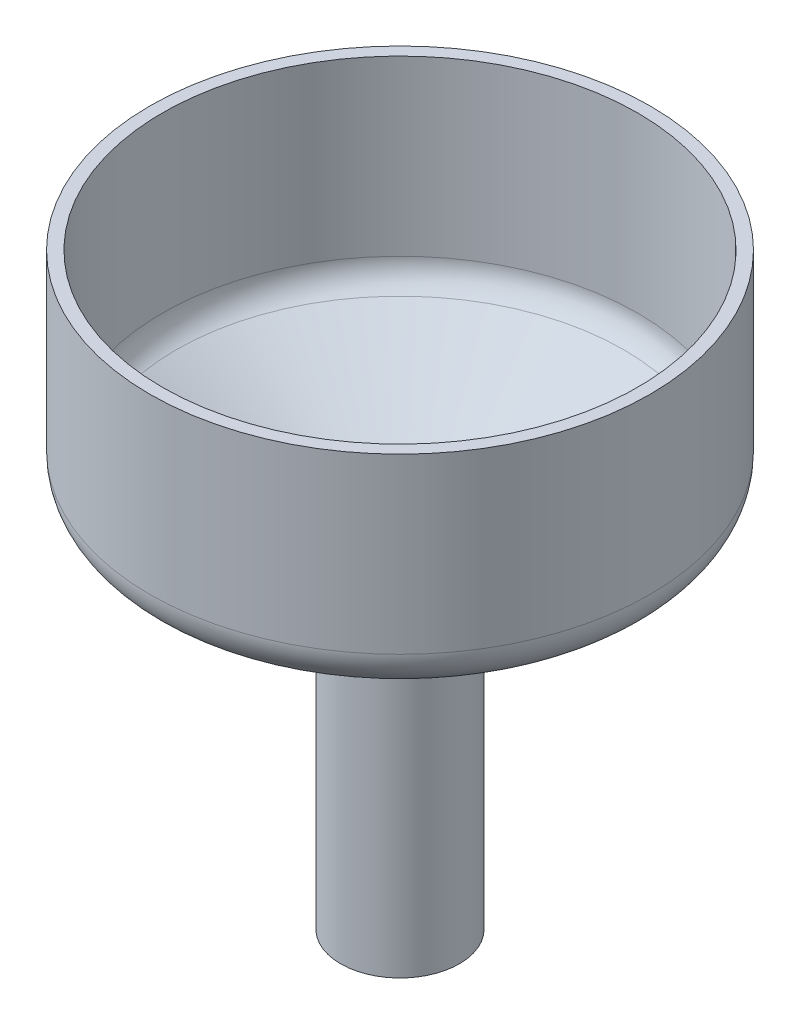
ISO-10303-21;
HEADER;
FILE_DESCRIPTION(('STEP AP214'),'2;1');
FILE_NAME('part.step','',(''),(''),'','','');
FILE_SCHEMA(('AUTOMOTIVE_DESIGN { 1 0 10303 214 1 1 1 1 }'));
ENDSEC;
DATA;
#1=APPLICATION_CONTEXT('core data for automotive mechanical design processes');
#2=APPLICATION_PROTOCOL_DEFINITION('international standard','automotive_design',2000,#1);
#3=PRODUCT_CONTEXT('',#1,'mechanical');
#4=PRODUCT('Part','Part','',(#3));
#5=PRODUCT_RELATED_PRODUCT_CATEGORY('part','',(#4));
#6=PRODUCT_DEFINITION_FORMATION('','',#4);
#7=PRODUCT_DEFINITION_CONTEXT('part definition',#1,'design');
#8=PRODUCT_DEFINITION('design','',#6,#7);
#9=PRODUCT_DEFINITION_SHAPE('','',#8);
#10=(LENGTH_UNIT() NAMED_UNIT(*) SI_UNIT(.MILLI.,.METRE.));
#11=(NAMED_UNIT(*) PLANE_ANGLE_UNIT() SI_UNIT($,.RADIAN.));
#12=(NAMED_UNIT(*) SI_UNIT($,.STERADIAN.) SOLID_ANGLE_UNIT());
#13=UNCERTAINTY_MEASURE_WITH_UNIT(LENGTH_MEASURE(1.E-05),#10,'distance_accuracy_value','');
#14=(GEOMETRIC_REPRESENTATION_CONTEXT(3) GLOBAL_UNCERTAINTY_ASSIGNED_CONTEXT((#13)) GLOBAL_UNIT_ASSIGNED_CONTEXT((#10,
#11,#12)) REPRESENTATION_CONTEXT('',''));
#15=CARTESIAN_POINT('',(0.,0.,0.));
#16=DIRECTION('',(0.,0.,1.));
#17=DIRECTION('',(1.,0.,0.));
#18=AXIS2_PLACEMENT_3D('',#15,#16,#17);
#19=CARTESIAN_POINT('',(0.,34.,0.));
#20=DIRECTION('',(0.,-1.,0.));
#21=DIRECTION('',(0.,0.,-1.));
#22=AXIS2_PLACEMENT_3D('',#19,#20,#21);
#23=CYLINDRICAL_SURFACE('',#22,7.25);
#24=CARTESIAN_POINT('',(0.,34.,0.));
#25=DIRECTION('',(0.,1.,0.));
#26=DIRECTION('',(0.,0.,1.));
#27=AXIS2_PLACEMENT_3D('',#24,#25,#26);
#28=CIRCLE('',#27,7.25);
#29=CARTESIAN_POINT('',(0.,34.,7.24999999999999));
#30=VERTEX_POINT('',#29);
#31=EDGE_CURVE('E50',#30,#30,#28,.T.);
#32=ORIENTED_EDGE('',*,*,#31,.F.);
#33=EDGE_LOOP('',(#32));
#34=FACE_BOUND('',#33,.T.);
#35=CARTESIAN_POINT('',(0.,0.,0.));
#36=DIRECTION('',(0.,1.,0.));
#37=DIRECTION('',(0.,0.,1.));
#38=AXIS2_PLACEMENT_3D('',#35,#36,#37);
#39=CIRCLE('',#38,7.25);
#40=CARTESIAN_POINT('',(0.,0.,7.25));
#41=VERTEX_POINT('',#40);
#42=EDGE_CURVE('E54',#41,#41,#39,.T.);
#43=ORIENTED_EDGE('',*,*,#42,.T.);
#44=EDGE_LOOP('',(#43));
#45=FACE_BOUND('',#44,.T.);
#46=ADVANCED_FACE('F39',(#34,#45),#23,.T.);
#47=CARTESIAN_POINT('',(0.,0.,0.));
#48=DIRECTION('',(0.,1.,0.));
#49=DIRECTION('',(0.,0.,1.));
#50=AXIS2_PLACEMENT_3D('',#47,#48,#49);
#51=PLANE('',#50);
#52=CARTESIAN_POINT('',(0.,0.,0.));
#53=DIRECTION('',(0.,1.,0.));
#54=DIRECTION('',(0.,0.,1.));
#55=AXIS2_PLACEMENT_3D('',#52,#53,#54);
#56=CIRCLE('',#55,5.75);
#57=CARTESIAN_POINT('',(0.,0.,5.75));
#58=VERTEX_POINT('',#57);
#59=EDGE_CURVE('E68',#58,#58,#56,.T.);
#60=ORIENTED_EDGE('',*,*,#59,.T.);
#61=EDGE_LOOP('',(#60));
#62=FACE_BOUND('',#61,.T.);
#63=ORIENTED_EDGE('',*,*,#42,.F.);
#64=EDGE_LOOP('',(#63));
#65=FACE_BOUND('',#64,.T.);
#66=ADVANCED_FACE('F98',(#62,#65),#51,.F.);
#67=CARTESIAN_POINT('',(0.,34.,0.));
#68=DIRECTION('',(0.,1.,0.));
#69=DIRECTION('',(0.,0.,1.));
#70=AXIS2_PLACEMENT_3D('',#67,#68,#69);
#71=CONICAL_SURFACE('',#70,7.25,1.0351341645638);
#72=CARTESIAN_POINT('',(0.,46.3470249026098,0.));
#73=DIRECTION('',(0.,1.,0.));
#74=DIRECTION('',(0.,0.,1.));
#75=AXIS2_PLACEMENT_3D('',#72,#73,#74);
#76=CIRCLE('',#75,28.0520528250491);
#77=CARTESIAN_POINT('',(0.,46.3470249026098,28.0520528250491));
#78=VERTEX_POINT('',#77);
#79=EDGE_CURVE('E11',#78,#78,#76,.F.);
#80=CARTESIAN_POINT('',(0.,46.3470249026098,28.0520528250491));
#81=CARTESIAN_POINT('',(0.,46.2184100598743,27.8353647747882));
#82=CARTESIAN_POINT('',(0.,46.0897952171388,27.6186767245273));
#83=CARTESIAN_POINT('',(0.,45.8325655316677,27.1853006240054));
#84=CARTESIAN_POINT('',(0.,45.7039506889322,26.9686125737445));
#85=CARTESIAN_POINT('',(0.,45.4467210034612,26.5352364732226));
#86=CARTESIAN_POINT('',(0.,45.3181061607256,26.3185484229617));
#87=CARTESIAN_POINT('',(0.,45.0608764752546,25.8851723224398));
#88=CARTESIAN_POINT('',(0.,44.9322616325191,25.6684842721789));
#89=CARTESIAN_POINT('',(0.,44.6750319470481,25.235108171657));
#90=CARTESIAN_POINT('',(0.,44.5464171043125,25.0184201213961));
#91=CARTESIAN_POINT('',(0.,44.2891874188415,24.5850440208743));
#92=CARTESIAN_POINT('',(0.,44.160572576106,24.3683559706133));
#93=CARTESIAN_POINT('',(0.,43.9033428906349,23.9349798700915));
#94=CARTESIAN_POINT('',(0.,43.7747280478994,23.7182918198305));
#95=CARTESIAN_POINT('',(0.,43.5174983624284,23.2849157193087));
#96=CARTESIAN_POINT('',(0.,43.3888835196929,23.0682276690478));
#97=CARTESIAN_POINT('',(0.,43.1316538342218,22.6348515685259));
#98=CARTESIAN_POINT('',(0.,43.0030389914863,22.418163518265));
#99=CARTESIAN_POINT('',(0.,42.7458093060153,21.9847874177431));
#100=CARTESIAN_POINT('',(0.,42.6171944632798,21.7680993674822));
#101=CARTESIAN_POINT('',(0.,42.3599647778087,21.3347232669603));
#102=CARTESIAN_POINT('',(0.,42.2313499350732,21.1180352166994));
#103=CARTESIAN_POINT('',(0.,41.9741202496022,20.6846591161776));
#104=CARTESIAN_POINT('',(0.,41.8455054068666,20.4679710659166));
#105=CARTESIAN_POINT('',(0.,41.5882757213956,20.0345949653948));
#106=CARTESIAN_POINT('',(0.,41.4596608786601,19.8179069151338));
#107=CARTESIAN_POINT('',(0.,41.202431193189,19.384530814612));
#108=CARTESIAN_POINT('',(0.,41.0738163504535,19.1678427643511));
#109=CARTESIAN_POINT('',(0.,40.8165866649825,18.7344666638292));
#110=CARTESIAN_POINT('',(0.,40.687971822247,18.5177786135683));
#111=CARTESIAN_POINT('',(0.,40.4307421367759,18.0844025130464));
#112=CARTESIAN_POINT('',(0.,40.3021272940404,17.8677144627855));
#113=CARTESIAN_POINT('',(0.,40.0448976085694,17.4343383622636));
#114=CARTESIAN_POINT('',(0.,39.9162827658339,17.2176503120027));
#115=CARTESIAN_POINT('',(0.,39.6590530803628,16.7842742114808));
#116=CARTESIAN_POINT('',(0.,39.5304382376273,16.5675861612199));
#117=CARTESIAN_POINT('',(0.,39.2732085521563,16.1342100606981));
#118=CARTESIAN_POINT('',(0.,39.1445937094207,15.9175220104371));
#119=CARTESIAN_POINT('',(0.,38.8873640239497,15.4841459099153));
#120=CARTESIAN_POINT('',(0.,38.7587491812142,15.2674578596543));
#121=CARTESIAN_POINT('',(0.,38.5015194957432,14.8340817591325));
#122=CARTESIAN_POINT('',(0.,38.3729046530076,14.6173937088716));
#123=CARTESIAN_POINT('',(0.,38.1156749675366,14.1840176083497));
#124=CARTESIAN_POINT('',(0.,37.9870601248011,13.9673295580888));
#125=CARTESIAN_POINT('',(0.,37.72983043933,13.5339534575669));
#126=CARTESIAN_POINT('',(0.,37.6012155965945,13.317265407306));
#127=CARTESIAN_POINT('',(0.,37.3439859111235,12.8838893067841));
#128=CARTESIAN_POINT('',(0.,37.215371068388,12.6672012565232));
#129=CARTESIAN_POINT('',(0.,36.9581413829169,12.2338251560013));
#130=CARTESIAN_POINT('',(0.,36.8295265401814,12.0171371057404));
#131=CARTESIAN_POINT('',(0.,36.5722968547104,11.5837610052186));
#132=CARTESIAN_POINT('',(0.,36.4436820119749,11.3670729549576));
#133=CARTESIAN_POINT('',(0.,36.1864523265038,10.9336968544358));
#134=CARTESIAN_POINT('',(0.,36.0578374837683,10.7170088041748));
#135=CARTESIAN_POINT('',(0.,35.8006077982973,10.283632703653));
#136=CARTESIAN_POINT('',(0.,35.6719929555617,10.0669446533921));
#137=CARTESIAN_POINT('',(0.,35.4147632700907,9.63356855287021));
#138=CARTESIAN_POINT('',(0.,35.2861484273552,9.41688050260928));
#139=CARTESIAN_POINT('',(0.,35.0289187418841,8.98350440208742));
#140=CARTESIAN_POINT('',(0.,34.9003038991486,8.76681635182649));
#141=CARTESIAN_POINT('',(0.,34.6430742136776,8.33344025130464));
#142=CARTESIAN_POINT('',(0.,34.5144593709421,8.11675220104371));
#143=CARTESIAN_POINT('',(0.,34.257229685471,7.68337610052185));
#144=CARTESIAN_POINT('',(0.,34.1286148427355,7.46668805026092));
#145=CARTESIAN_POINT('',(0.,34.,7.24999999999999));
#146=B_SPLINE_CURVE_WITH_KNOTS('',3,(#80,#81,#82,#83,#84,#85,#86,#87,#88,#89,#90,#91,#92,#93,
#94,#95,#96,#97,#98,#99,#100,#101,#102,#103,#104,#105,#106,#107,#108,#109,#110,#111,#112,#113,
#114,#115,#116,#117,#118,#119,#120,#121,#122,#123,#124,#125,#126,#127,#128,#129,#130,#131,#132,
#133,#134,#135,#136,#137,#138,#139,#140,#141,#142,#143,#144,#145),.UNSPECIFIED.,.F.,.F.,(4,2,2,
2,2,2,2,2,2,2,2,2,2,2,2,2,2,2,2,2,2,2,2,2,2,2,2,2,2,2,2,2,4),(0.,0.755949336979588,
1.51189867395918,2.26784801093877,3.02379734791836,3.77974668489795,4.53569602187754,
5.29164535885714,6.04759469583672,6.80354403281632,7.55949336979591,8.3154427067755,
9.07139204375509,9.82734138073468,10.5832907177143,11.3392400546939,12.0951893916735,
12.851138728653,13.6070880656326,14.3630374026122,15.1189867395918,15.8749360765714,
16.630885413551,17.3868347505306,18.1427840875102,18.8987334244898,19.6546827614694,
20.410632098449,21.1665814354285,21.9225307724081,22.6784801093877,23.4344294463673,
24.1903787833469),.UNSPECIFIED.);
#147=EDGE_CURVE('BSEAM104',#78,#30,#146,.T.);
#148=ORIENTED_EDGE('',*,*,#79,.T.);
#149=ORIENTED_EDGE('',*,*,#31,.T.);
#150=ORIENTED_EDGE('',*,*,#147,.T.);
#151=ORIENTED_EDGE('',*,*,#147,.F.);
#152=EDGE_LOOP('',(#148,#150,#149,#151));
#153=FACE_BOUND('',#152,.T.);
#154=ADVANCED_FACE('F104',(#153),#71,.T.);
#155=CARTESIAN_POINT('',(0.,71.8,0.));
#156=DIRECTION('',(0.,-1.,0.));
#157=DIRECTION('',(0.,0.,-1.));
#158=AXIS2_PLACEMENT_3D('',#155,#156,#157);
#159=CYLINDRICAL_SURFACE('',#158,30.5);
#160=CARTESIAN_POINT('',(0.,50.6466791187252,0.));
#161=DIRECTION('',(0.,-1.,0.));
#162=DIRECTION('',(0.,0.,-1.));
#163=AXIS2_PLACEMENT_3D('',#160,#161,#162);
#164=CIRCLE('',#163,30.5);
#165=CARTESIAN_POINT('',(0.,50.6466791187252,-30.5));
#166=VERTEX_POINT('',#165);
#167=EDGE_CURVE('E46',#166,#166,#164,.F.);
#168=ORIENTED_EDGE('',*,*,#167,.T.);
#169=EDGE_LOOP('',(#168));
#170=FACE_BOUND('',#169,.T.);
#171=CARTESIAN_POINT('',(0.,71.8,0.));
#172=DIRECTION('',(0.,1.,0.));
#173=DIRECTION('',(0.,0.,1.));
#174=AXIS2_PLACEMENT_3D('',#171,#172,#173);
#175=CIRCLE('',#174,30.5);
#176=CARTESIAN_POINT('',(0.,71.8,30.5));
#177=VERTEX_POINT('',#176);
#178=EDGE_CURVE('E61',#177,#177,#175,.T.);
#179=ORIENTED_EDGE('',*,*,#178,.F.);
#180=EDGE_LOOP('',(#179));
#181=FACE_BOUND('',#180,.T.);
#182=ADVANCED_FACE('F111',(#170,#181),#159,.T.);
#183=CARTESIAN_POINT('',(0.,71.8,0.));
#184=DIRECTION('',(0.,1.,0.));
#185=DIRECTION('',(0.,0.,1.));
#186=AXIS2_PLACEMENT_3D('',#183,#184,#185);
#187=PLANE('',#186);
#188=CARTESIAN_POINT('',(0.,71.8,0.));
#189=DIRECTION('',(0.,1.,0.));
#190=DIRECTION('',(0.,0.,1.));
#191=AXIS2_PLACEMENT_3D('',#188,#189,#190);
#192=CIRCLE('',#191,29.);
#193=CARTESIAN_POINT('',(0.,71.8,29.));
#194=VERTEX_POINT('',#193);
#195=EDGE_CURVE('E65',#194,#194,#192,.T.);
#196=ORIENTED_EDGE('',*,*,#195,.F.);
#197=EDGE_LOOP('',(#196));
#198=FACE_BOUND('',#197,.T.);
#199=ORIENTED_EDGE('',*,*,#178,.T.);
#200=EDGE_LOOP('',(#199));
#201=FACE_BOUND('',#200,.T.);
#202=ADVANCED_FACE('F114',(#198,#201),#187,.T.);
#203=CARTESIAN_POINT('',(0.,50.6466791187252,0.));
#204=DIRECTION('',(0.,-1.,0.));
#205=DIRECTION('',(0.,0.,-1.));
#206=AXIS2_PLACEMENT_3D('',#203,#204,#205);
#207=TOROIDAL_SURFACE('',#206,25.5,5.);
#208=ORIENTED_EDGE('',*,*,#79,.F.);
#209=EDGE_LOOP('',(#208));
#210=FACE_BOUND('',#209,.T.);
#211=ORIENTED_EDGE('',*,*,#167,.F.);
#212=EDGE_LOOP('',(#211));
#213=FACE_BOUND('',#212,.T.);
#214=ADVANCED_FACE('F41',(#210,#213),#207,.T.);
#215=CARTESIAN_POINT('',(0.,34.,0.));
#216=DIRECTION('',(0.,-1.,0.));
#217=DIRECTION('',(0.,0.,-1.));
#218=AXIS2_PLACEMENT_3D('',#215,#216,#217);
#219=CYLINDRICAL_SURFACE('',#218,5.75);
#220=CARTESIAN_POINT('',(0.,34.8540037356176,0.));
#221=DIRECTION('',(0.,1.,0.));
#222=DIRECTION('',(0.,0.,1.));
#223=AXIS2_PLACEMENT_3D('',#220,#221,#222);
#224=CIRCLE('',#223,5.75);
#225=CARTESIAN_POINT('',(0.,34.8540037356175,5.74999999999999));
#226=VERTEX_POINT('',#225);
#227=EDGE_CURVE('E71',#226,#226,#224,.T.);
#228=ORIENTED_EDGE('',*,*,#227,.T.);
#229=EDGE_LOOP('',(#228));
#230=FACE_BOUND('',#229,.T.);
#231=ORIENTED_EDGE('',*,*,#59,.F.);
#232=EDGE_LOOP('',(#231));
#233=FACE_BOUND('',#232,.T.);
#234=ADVANCED_FACE('F80',(#230,#233),#219,.F.);
#235=CARTESIAN_POINT('',(0.,35.2898962648346,0.));
#236=DIRECTION('',(0.,1.,0.));
#237=DIRECTION('',(0.,0.,1.));
#238=AXIS2_PLACEMENT_3D('',#235,#236,#237);
#239=CONICAL_SURFACE('',#238,6.48438415248526,1.0351341645638);
#240=CARTESIAN_POINT('',(0.,47.6369211674444,0.));
#241=DIRECTION('',(0.,1.,0.));
#242=DIRECTION('',(0.,0.,1.));
#243=AXIS2_PLACEMENT_3D('',#240,#241,#242);
#244=CIRCLE('',#243,27.2864369775344);
#245=CARTESIAN_POINT('',(0.,47.6369211674444,27.2864369775344));
#246=VERTEX_POINT('',#245);
#247=EDGE_CURVE('E64',#246,#246,#244,.F.);
#248=CARTESIAN_POINT('',(0.,47.6369211674444,27.2864369775344));
#249=CARTESIAN_POINT('',(0.,47.5037657775296,27.0620990923517));
#250=CARTESIAN_POINT('',(0.,47.3706103876147,26.8377612071691));
#251=CARTESIAN_POINT('',(0.,47.104299607785,26.3890854368038));
#252=CARTESIAN_POINT('',(0.,46.9711442178701,26.1647475516211));
#253=CARTESIAN_POINT('',(0.,46.7048334380404,25.7160717812558));
#254=CARTESIAN_POINT('',(0.,46.5716780481255,25.4917338960732));
#255=CARTESIAN_POINT('',(0.,46.3053672682958,25.0430581257079));
#256=CARTESIAN_POINT('',(0.,46.1722118783809,24.8187202405252));
#257=CARTESIAN_POINT('',(0.,45.9059010985512,24.3700444701599));
#258=CARTESIAN_POINT('',(0.,45.7727457086363,24.1457065849773));
#259=CARTESIAN_POINT('',(0.,45.5064349288066,23.697030814612));
#260=CARTESIAN_POINT('',(0.,45.3732795388917,23.4726929294293));
#261=CARTESIAN_POINT('',(0.,45.106968759062,23.024017159064));
#262=CARTESIAN_POINT('',(0.,44.9738133691472,22.7996792738814));
#263=CARTESIAN_POINT('',(0.,44.7075025893174,22.3510035035161));
#264=CARTESIAN_POINT('',(0.,44.5743471994026,22.1266656183334));
#265=CARTESIAN_POINT('',(0.,44.3080364195728,21.6779898479681));
#266=CARTESIAN_POINT('',(0.,44.174881029658,21.4536519627855));
#267=CARTESIAN_POINT('',(0.,43.9085702498283,21.0049761924202));
#268=CARTESIAN_POINT('',(0.,43.7754148599134,20.7806383072375));
#269=CARTESIAN_POINT('',(0.,43.5091040800837,20.3319625368722));
#270=CARTESIAN_POINT('',(0.,43.3759486901688,20.1076246516896));
#271=CARTESIAN_POINT('',(0.,43.1096379103391,19.6589488813243));
#272=CARTESIAN_POINT('',(0.,42.9764825204242,19.4346109961416));
#273=CARTESIAN_POINT('',(0.,42.7101717405945,18.9859352257763));
#274=CARTESIAN_POINT('',(0.,42.5770163506796,18.7615973405937));
#275=CARTESIAN_POINT('',(0.,42.3107055708499,18.3129215702284));
#276=CARTESIAN_POINT('',(0.,42.177550180935,18.0885836850457));
#277=CARTESIAN_POINT('',(0.,41.9112394011053,17.6399079146804));
#278=CARTESIAN_POINT('',(0.,41.7780840111904,17.4155700294978));
#279=CARTESIAN_POINT('',(0.,41.5117732313607,16.9668942591325));
#280=CARTESIAN_POINT('',(0.,41.3786178414458,16.7425563739498));
#281=CARTESIAN_POINT('',(0.,41.1123070616161,16.2938806035845));
#282=CARTESIAN_POINT('',(0.,40.9791516717013,16.0695427184019));
#283=CARTESIAN_POINT('',(0.,40.7128408918715,15.6208669480366));
#284=CARTESIAN_POINT('',(0.,40.5796855019567,15.3965290628539));
#285=CARTESIAN_POINT('',(0.,40.3133747221269,14.9478532924886));
#286=CARTESIAN_POINT('',(0.,40.1802193322121,14.723515407306));
#287=CARTESIAN_POINT('',(0.,39.9139085523824,14.2748396369407));
#288=CARTESIAN_POINT('',(0.,39.7807531624675,14.050501751758));
#289=CARTESIAN_POINT('',(0.,39.5144423826378,13.6018259813927));
#290=CARTESIAN_POINT('',(0.,39.3812869927229,13.3774880962101));
#291=CARTESIAN_POINT('',(0.,39.1149762128932,12.9288123258448));
#292=CARTESIAN_POINT('',(0.,38.9818208229783,12.7044744406621));
#293=CARTESIAN_POINT('',(0.,38.7155100431486,12.2557986702968));
#294=CARTESIAN_POINT('',(0.,38.5823546532337,12.0314607851142));
#295=CARTESIAN_POINT('',(0.,38.316043873404,11.5827850147489));
#296=CARTESIAN_POINT('',(0.,38.1828884834891,11.3584471295662));
#297=CARTESIAN_POINT('',(0.,37.9165777036594,10.9097713592009));
#298=CARTESIAN_POINT('',(0.,37.7834223137445,10.6854334740183));
#299=CARTESIAN_POINT('',(0.,37.5171115339148,10.236757703653));
#300=CARTESIAN_POINT('',(0.,37.383956144,10.0124198184703));
#301=CARTESIAN_POINT('',(0.,37.1176453641702,9.56374404810504));
#302=CARTESIAN_POINT('',(0.,36.9844899742554,9.33940616292239));
#303=CARTESIAN_POINT('',(0.,36.7181791944256,8.89073039255709));
#304=CARTESIAN_POINT('',(0.,36.5850238045108,8.66639250737444));
#305=CARTESIAN_POINT('',(0.,36.318713024681,8.21771673700914));
#306=CARTESIAN_POINT('',(0.,36.1855576347662,7.99337885182649));
#307=CARTESIAN_POINT('',(0.,35.9192468549365,7.54470308146119));
#308=CARTESIAN_POINT('',(0.,35.7860914650216,7.32036519627854));
#309=CARTESIAN_POINT('',(0.,35.5197806851919,6.87168942591324));
#310=CARTESIAN_POINT('',(0.,35.386625295277,6.64735154073059));
#311=CARTESIAN_POINT('',(0.,35.1203145154473,6.19867577036529));
#312=CARTESIAN_POINT('',(0.,34.9871591255324,5.97433788518264));
#313=CARTESIAN_POINT('',(0.,34.8540037356175,5.74999999999999));
#314=B_SPLINE_CURVE_WITH_KNOTS('',3,(#248,#249,#250,#251,#252,#253,#254,#255,#256,#257,#258,
#259,#260,#261,#262,#263,#264,#265,#266,#267,#268,#269,#270,#271,#272,#273,#274,#275,#276,#277,
#278,#279,#280,#281,#282,#283,#284,#285,#286,#287,#288,#289,#290,#291,#292,#293,#294,#295,#296,
#297,#298,#299,#300,#301,#302,#303,#304,#305,#306,#307,#308,#309,#310,#311,#312,#313),
.UNSPECIFIED.,.F.,.F.,(4,2,2,2,2,2,2,2,2,2,2,2,2,2,2,2,2,2,2,2,2,2,2,2,2,2,2,2,2,2,2,2,4),(0.,
0.782636953717642,1.56527390743528,2.34791086115292,3.13054781487056,3.9131847685882,
4.69582172230584,5.47845867602348,6.26109562974112,7.04373258345876,7.8263695371764,
8.60900649089404,9.39164344461168,10.1742803983293,10.956917352047,11.7395543057646,
12.5221912594822,13.3048282131999,14.0874651669175,14.8701021206352,15.6527390743528,
16.4353760280705,17.2180129817881,18.0006499355057,18.7832868892234,19.565923842941,
20.3485607966586,21.1311977503763,21.9138347040939,22.6964716578116,23.4791086115292,
24.2617455652469,25.0443825189645),.UNSPECIFIED.);
#315=EDGE_CURVE('BSEAM83',#246,#226,#314,.T.);
#316=ORIENTED_EDGE('',*,*,#247,.F.);
#317=ORIENTED_EDGE('',*,*,#227,.F.);
#318=ORIENTED_EDGE('',*,*,#315,.T.);
#319=ORIENTED_EDGE('',*,*,#315,.F.);
#320=EDGE_LOOP('',(#316,#318,#317,#319));
#321=FACE_BOUND('',#320,.T.);
#322=ADVANCED_FACE('F83',(#321),#239,.F.);
#323=CARTESIAN_POINT('',(0.,71.8,0.));
#324=DIRECTION('',(0.,-1.,0.));
#325=DIRECTION('',(0.,0.,-1.));
#326=AXIS2_PLACEMENT_3D('',#323,#324,#325);
#327=CYLINDRICAL_SURFACE('',#326,29.);
#328=CARTESIAN_POINT('',(0.,50.6466791187252,0.));
#329=DIRECTION('',(0.,-1.,0.));
#330=DIRECTION('',(0.,0.,-1.));
#331=AXIS2_PLACEMENT_3D('',#328,#329,#330);
#332=CIRCLE('',#331,29.);
#333=CARTESIAN_POINT('',(0.,50.6466791187252,-29.));
#334=VERTEX_POINT('',#333);
#335=EDGE_CURVE('E72',#334,#334,#332,.F.);
#336=ORIENTED_EDGE('',*,*,#335,.F.);
#337=EDGE_LOOP('',(#336));
#338=FACE_BOUND('',#337,.T.);
#339=ORIENTED_EDGE('',*,*,#195,.T.);
#340=EDGE_LOOP('',(#339));
#341=FACE_BOUND('',#340,.T.);
#342=ADVANCED_FACE('F85',(#338,#341),#327,.F.);
#343=CARTESIAN_POINT('',(0.,50.6466791187252,0.));
#344=DIRECTION('',(0.,-1.,0.));
#345=DIRECTION('',(0.,0.,-1.));
#346=AXIS2_PLACEMENT_3D('',#343,#344,#345);
#347=TOROIDAL_SURFACE('',#346,25.5,3.5);
#348=ORIENTED_EDGE('',*,*,#247,.T.);
#349=EDGE_LOOP('',(#348));
#350=FACE_BOUND('',#349,.T.);
#351=ORIENTED_EDGE('',*,*,#335,.T.);
#352=EDGE_LOOP('',(#351));
#353=FACE_BOUND('',#352,.T.);
#354=ADVANCED_FACE('F92',(#350,#353),#347,.F.);
#355=CLOSED_SHELL('',(#46,#66,#154,#182,#202,#214,#234,#322,#342,#354));
#356=MANIFOLD_SOLID_BREP('B2',#355);
#357=ADVANCED_BREP_SHAPE_REPRESENTATION('',(#18,#356),#14);
#358=SHAPE_DEFINITION_REPRESENTATION(#9,#357);
ENDSEC;
END-ISO-10303-21;
